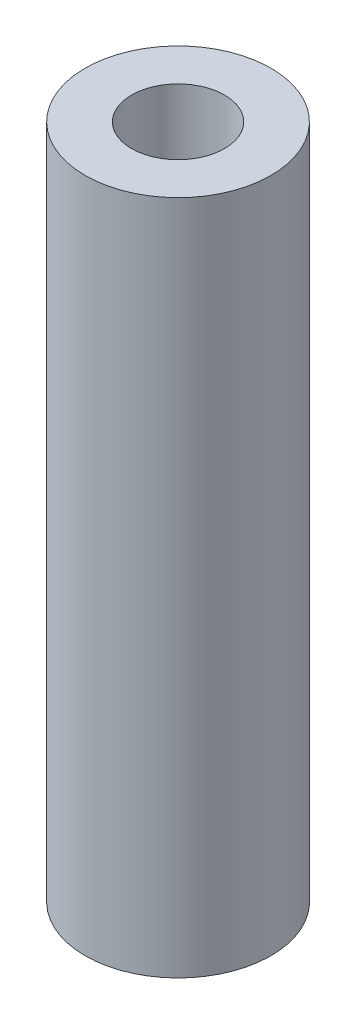
ISO-10303-21;
HEADER;
FILE_DESCRIPTION(('STEP AP214'),'2;1');
FILE_NAME('part.step','',(''),(''),'','','');
FILE_SCHEMA(('AUTOMOTIVE_DESIGN { 1 0 10303 214 1 1 1 1 }'));
ENDSEC;
DATA;
#1=APPLICATION_CONTEXT('core data for automotive mechanical design processes');
#2=APPLICATION_PROTOCOL_DEFINITION('international standard','automotive_design',2000,#1);
#3=PRODUCT_CONTEXT('',#1,'mechanical');
#4=PRODUCT('Part','Part','',(#3));
#5=PRODUCT_RELATED_PRODUCT_CATEGORY('part','',(#4));
#6=PRODUCT_DEFINITION_FORMATION('','',#4);
#7=PRODUCT_DEFINITION_CONTEXT('part definition',#1,'design');
#8=PRODUCT_DEFINITION('design','',#6,#7);
#9=PRODUCT_DEFINITION_SHAPE('','',#8);
#10=(LENGTH_UNIT() NAMED_UNIT(*) SI_UNIT(.MILLI.,.METRE.));
#11=(NAMED_UNIT(*) PLANE_ANGLE_UNIT() SI_UNIT($,.RADIAN.));
#12=(NAMED_UNIT(*) SI_UNIT($,.STERADIAN.) SOLID_ANGLE_UNIT());
#13=UNCERTAINTY_MEASURE_WITH_UNIT(LENGTH_MEASURE(1.E-05),#10,'distance_accuracy_value','');
#14=(GEOMETRIC_REPRESENTATION_CONTEXT(3) GLOBAL_UNCERTAINTY_ASSIGNED_CONTEXT((#13)) GLOBAL_UNIT_ASSIGNED_CONTEXT((#10,
#11,#12)) REPRESENTATION_CONTEXT('',''));
#15=CARTESIAN_POINT('',(0.,0.,0.));
#16=DIRECTION('',(0.,0.,1.));
#17=DIRECTION('',(1.,0.,0.));
#18=AXIS2_PLACEMENT_3D('',#15,#16,#17);
#19=CARTESIAN_POINT('',(0.,40.,0.));
#20=DIRECTION('',(0.,1.,0.));
#21=DIRECTION('',(0.,0.,1.));
#22=AXIS2_PLACEMENT_3D('',#19,#20,#21);
#23=PLANE('',#22);
#24=CARTESIAN_POINT('',(0.,40.,0.));
#25=DIRECTION('',(0.,1.,0.));
#26=DIRECTION('',(0.,0.,1.));
#27=AXIS2_PLACEMENT_3D('',#24,#25,#26);
#28=CIRCLE('',#27,11.);
#29=CARTESIAN_POINT('',(0.,40.,11.));
#30=VERTEX_POINT('',#29);
#31=EDGE_CURVE('E10',#30,#30,#28,.T.);
#32=ORIENTED_EDGE('',*,*,#31,.T.);
#33=EDGE_LOOP('',(#32));
#34=FACE_BOUND('',#33,.T.);
#35=CARTESIAN_POINT('',(0.,40.,0.));
#36=DIRECTION('',(0.,1.,0.));
#37=DIRECTION('',(0.,0.,1.));
#38=AXIS2_PLACEMENT_3D('',#35,#36,#37);
#39=CIRCLE('',#38,5.5);
#40=CARTESIAN_POINT('',(0.,40.,5.5));
#41=VERTEX_POINT('',#40);
#42=EDGE_CURVE('E52',#41,#41,#39,.T.);
#43=ORIENTED_EDGE('',*,*,#42,.F.);
#44=EDGE_LOOP('',(#43));
#45=FACE_BOUND('',#44,.T.);
#46=ADVANCED_FACE('F41',(#34,#45),#23,.T.);
#47=CARTESIAN_POINT('',(0.,-40.,0.));
#48=DIRECTION('',(0.,1.,0.));
#49=DIRECTION('',(0.,0.,1.));
#50=AXIS2_PLACEMENT_3D('',#47,#48,#49);
#51=PLANE('',#50);
#52=CARTESIAN_POINT('',(0.,-40.,0.));
#53=DIRECTION('',(0.,1.,0.));
#54=DIRECTION('',(0.,0.,1.));
#55=AXIS2_PLACEMENT_3D('',#52,#53,#54);
#56=CIRCLE('',#55,11.);
#57=CARTESIAN_POINT('',(0.,-40.,11.));
#58=VERTEX_POINT('',#57);
#59=EDGE_CURVE('E45',#58,#58,#56,.T.);
#60=ORIENTED_EDGE('',*,*,#59,.F.);
#61=EDGE_LOOP('',(#60));
#62=FACE_BOUND('',#61,.T.);
#63=CARTESIAN_POINT('',(0.,-40.,0.));
#64=DIRECTION('',(0.,1.,0.));
#65=DIRECTION('',(0.,0.,1.));
#66=AXIS2_PLACEMENT_3D('',#63,#64,#65);
#67=CIRCLE('',#66,5.5);
#68=CARTESIAN_POINT('',(0.,-40.,5.5));
#69=VERTEX_POINT('',#68);
#70=EDGE_CURVE('E54',#69,#69,#67,.T.);
#71=ORIENTED_EDGE('',*,*,#70,.T.);
#72=EDGE_LOOP('',(#71));
#73=FACE_BOUND('',#72,.T.);
#74=ADVANCED_FACE('F64',(#62,#73),#51,.F.);
#75=CARTESIAN_POINT('',(0.,40.,0.));
#76=DIRECTION('',(0.,-1.,0.));
#77=DIRECTION('',(0.,0.,-1.));
#78=AXIS2_PLACEMENT_3D('',#75,#76,#77);
#79=CYLINDRICAL_SURFACE('',#78,11.);
#80=ORIENTED_EDGE('',*,*,#31,.F.);
#81=EDGE_LOOP('',(#80));
#82=FACE_BOUND('',#81,.T.);
#83=ORIENTED_EDGE('',*,*,#59,.T.);
#84=EDGE_LOOP('',(#83));
#85=FACE_BOUND('',#84,.T.);
#86=ADVANCED_FACE('F43',(#82,#85),#79,.T.);
#87=CARTESIAN_POINT('',(0.,40.,0.));
#88=DIRECTION('',(0.,-1.,0.));
#89=DIRECTION('',(0.,0.,-1.));
#90=AXIS2_PLACEMENT_3D('',#87,#88,#89);
#91=CYLINDRICAL_SURFACE('',#90,5.5);
#92=ORIENTED_EDGE('',*,*,#42,.T.);
#93=EDGE_LOOP('',(#92));
#94=FACE_BOUND('',#93,.T.);
#95=ORIENTED_EDGE('',*,*,#70,.F.);
#96=EDGE_LOOP('',(#95));
#97=FACE_BOUND('',#96,.T.);
#98=ADVANCED_FACE('F60',(#94,#97),#91,.F.);
#99=CLOSED_SHELL('',(#46,#74,#86,#98));
#100=MANIFOLD_SOLID_BREP('B2',#99);
#101=ADVANCED_BREP_SHAPE_REPRESENTATION('',(#18,#100),#14);
#102=SHAPE_DEFINITION_REPRESENTATION(#9,#101);
ENDSEC;
END-ISO-10303-21;
